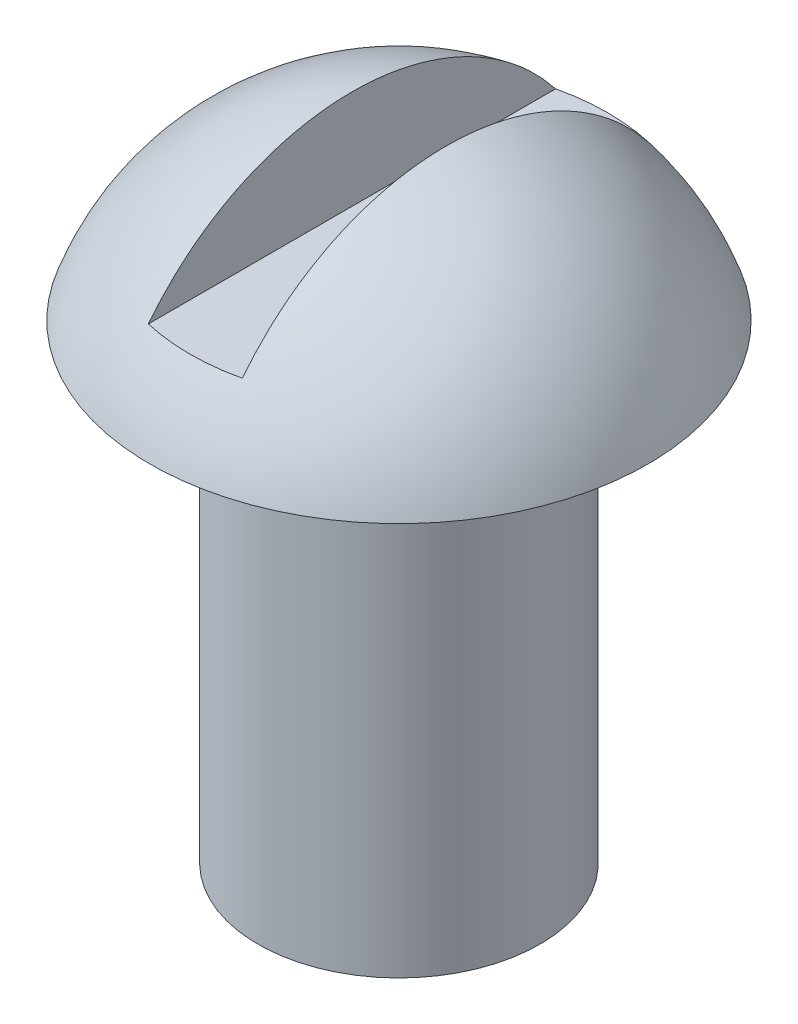
ISO-10303-21;
HEADER;
FILE_DESCRIPTION(('STEP AP214'),'2;1');
FILE_NAME('part.step','',(''),(''),'','','');
FILE_SCHEMA(('AUTOMOTIVE_DESIGN { 1 0 10303 214 1 1 1 1 }'));
ENDSEC;
DATA;
#1=APPLICATION_CONTEXT('core data for automotive mechanical design processes');
#2=APPLICATION_PROTOCOL_DEFINITION('international standard','automotive_design',2000,#1);
#3=PRODUCT_CONTEXT('',#1,'mechanical');
#4=PRODUCT('Part','Part','',(#3));
#5=PRODUCT_RELATED_PRODUCT_CATEGORY('part','',(#4));
#6=PRODUCT_DEFINITION_FORMATION('','',#4);
#7=PRODUCT_DEFINITION_CONTEXT('part definition',#1,'design');
#8=PRODUCT_DEFINITION('design','',#6,#7);
#9=PRODUCT_DEFINITION_SHAPE('','',#8);
#10=(LENGTH_UNIT() NAMED_UNIT(*) SI_UNIT(.MILLI.,.METRE.));
#11=(NAMED_UNIT(*) PLANE_ANGLE_UNIT() SI_UNIT($,.RADIAN.));
#12=(NAMED_UNIT(*) SI_UNIT($,.STERADIAN.) SOLID_ANGLE_UNIT());
#13=UNCERTAINTY_MEASURE_WITH_UNIT(LENGTH_MEASURE(1.E-05),#10,'distance_accuracy_value','');
#14=(GEOMETRIC_REPRESENTATION_CONTEXT(3) GLOBAL_UNCERTAINTY_ASSIGNED_CONTEXT((#13)) GLOBAL_UNIT_ASSIGNED_CONTEXT((#10,
#11,#12)) REPRESENTATION_CONTEXT('',''));
#15=CARTESIAN_POINT('',(0.,0.,0.));
#16=DIRECTION('',(0.,0.,1.));
#17=DIRECTION('',(1.,0.,0.));
#18=AXIS2_PLACEMENT_3D('',#15,#16,#17);
#19=CARTESIAN_POINT('',(0.,0.,0.));
#20=DIRECTION('',(0.,-1.,0.));
#21=DIRECTION('',(0.,0.,-1.));
#22=AXIS2_PLACEMENT_3D('',#19,#20,#21);
#23=PLANE('',#22);
#24=CARTESIAN_POINT('',(0.,0.,0.));
#25=DIRECTION('',(0.,-1.,0.));
#26=DIRECTION('',(0.,0.,-1.));
#27=AXIS2_PLACEMENT_3D('',#24,#25,#26);
#28=CIRCLE('',#27,2.65);
#29=CARTESIAN_POINT('',(0.,0.,-2.65));
#30=VERTEX_POINT('',#29);
#31=EDGE_CURVE('E65',#30,#30,#28,.T.);
#32=ORIENTED_EDGE('',*,*,#31,.T.);
#33=EDGE_LOOP('',(#32));
#34=FACE_BOUND('',#33,.T.);
#35=CARTESIAN_POINT('',(0.,0.,0.));
#36=DIRECTION('',(0.,-1.,0.));
#37=DIRECTION('',(0.,0.,-1.));
#38=AXIS2_PLACEMENT_3D('',#35,#36,#37);
#39=CIRCLE('',#38,1.5);
#40=CARTESIAN_POINT('',(0.,0.,-1.5));
#41=VERTEX_POINT('',#40);
#42=EDGE_CURVE('E75',#41,#41,#39,.T.);
#43=ORIENTED_EDGE('',*,*,#42,.F.);
#44=EDGE_LOOP('',(#43));
#45=FACE_BOUND('',#44,.T.);
#46=ADVANCED_FACE('F32',(#34,#45),#23,.T.);
#47=CARTESIAN_POINT('',(0.,-0.898026315789473,0.));
#48=DIRECTION('',(0.,-1.,0.));
#49=DIRECTION('',(1.,0.,0.));
#50=AXIS2_PLACEMENT_3D('',#47,#48,#49);
#51=SPHERICAL_SURFACE('',#50,2.79802631578947);
#52=ORIENTED_EDGE('',*,*,#31,.F.);
#53=EDGE_LOOP('',(#52));
#54=FACE_BOUND('',#53,.T.);
#55=CARTESIAN_POINT('',(-0.5,-0.898026315789473,0.));
#56=DIRECTION('',(-1.,0.,0.));
#57=DIRECTION('',(0.,0.,1.));
#58=AXIS2_PLACEMENT_3D('',#55,#56,#57);
#59=CIRCLE('',#58,2.75298951393761);
#60=CARTESIAN_POINT('',(-0.5,0.8,-2.16694667556376));
#61=VERTEX_POINT('',#60);
#62=CARTESIAN_POINT('',(-0.5,0.8,2.16694667556376));
#63=VERTEX_POINT('',#62);
#64=EDGE_CURVE('E64',#61,#63,#59,.F.);
#65=ORIENTED_EDGE('',*,*,#64,.F.);
#66=CARTESIAN_POINT('',(0.,0.8,0.));
#67=DIRECTION('',(0.,1.,0.));
#68=DIRECTION('',(0.,0.,1.));
#69=AXIS2_PLACEMENT_3D('',#66,#67,#68);
#70=CIRCLE('',#69,2.22388351644974);
#71=CARTESIAN_POINT('',(0.5,0.8,-2.16694667556376));
#72=VERTEX_POINT('',#71);
#73=EDGE_CURVE('E11',#61,#72,#70,.F.);
#74=ORIENTED_EDGE('',*,*,#73,.T.);
#75=CARTESIAN_POINT('',(0.5,-0.898026315789473,0.));
#76=DIRECTION('',(1.,0.,0.));
#77=DIRECTION('',(0.,0.,-1.));
#78=AXIS2_PLACEMENT_3D('',#75,#76,#77);
#79=CIRCLE('',#78,2.75298951393761);
#80=CARTESIAN_POINT('',(0.5,0.8,2.16694667556376));
#81=VERTEX_POINT('',#80);
#82=EDGE_CURVE('E36',#81,#72,#79,.F.);
#83=ORIENTED_EDGE('',*,*,#82,.F.);
#84=EDGE_CURVE('E42',#81,#63,#70,.F.);
#85=ORIENTED_EDGE('',*,*,#84,.T.);
#86=EDGE_LOOP('',(#65,#74,#83,#85));
#87=FACE_BOUND('',#86,.T.);
#88=ADVANCED_FACE('F34',(#54,#87),#51,.T.);
#89=CARTESIAN_POINT('',(0.5,0.8,-2.95379049089046));
#90=DIRECTION('',(1.,0.,0.));
#91=DIRECTION('',(0.,0.,-1.));
#92=AXIS2_PLACEMENT_3D('',#89,#90,#91);
#93=PLANE('',#92);
#94=ORIENTED_EDGE('',*,*,#82,.T.);
#95=DIRECTION('',(0.,0.,-1.));
#96=VECTOR('',#95,1.);
#97=CARTESIAN_POINT('',(0.5,0.8,-2.95379049089046));
#98=LINE('',#97,#96);
#99=EDGE_CURVE('E60',#81,#72,#98,.T.);
#100=ORIENTED_EDGE('',*,*,#99,.F.);
#101=EDGE_LOOP('',(#94,#100));
#102=FACE_BOUND('',#101,.T.);
#103=ADVANCED_FACE('F67',(#102),#93,.F.);
#104=CARTESIAN_POINT('',(-0.5,0.8,-2.95379049089046));
#105=DIRECTION('',(-1.,0.,0.));
#106=DIRECTION('',(0.,0.,1.));
#107=AXIS2_PLACEMENT_3D('',#104,#105,#106);
#108=PLANE('',#107);
#109=ORIENTED_EDGE('',*,*,#64,.T.);
#110=DIRECTION('',(0.,0.,1.));
#111=VECTOR('',#110,1.);
#112=CARTESIAN_POINT('',(-0.5,0.8,-2.95379049089046));
#113=LINE('',#112,#111);
#114=EDGE_CURVE('E49',#61,#63,#113,.T.);
#115=ORIENTED_EDGE('',*,*,#114,.F.);
#116=EDGE_LOOP('',(#109,#115));
#117=FACE_BOUND('',#116,.T.);
#118=ADVANCED_FACE('F98',(#117),#108,.F.);
#119=CARTESIAN_POINT('',(0.5,0.8,2.95379049089046));
#120=DIRECTION('',(0.,1.,0.));
#121=DIRECTION('',(0.,0.,1.));
#122=AXIS2_PLACEMENT_3D('',#119,#120,#121);
#123=PLANE('',#122);
#124=ORIENTED_EDGE('',*,*,#114,.T.);
#125=ORIENTED_EDGE('',*,*,#84,.F.);
#126=ORIENTED_EDGE('',*,*,#99,.T.);
#127=ORIENTED_EDGE('',*,*,#73,.F.);
#128=EDGE_LOOP('',(#124,#125,#126,#127));
#129=FACE_BOUND('',#128,.T.);
#130=ADVANCED_FACE('F59',(#129),#123,.T.);
#131=CARTESIAN_POINT('',(0.,-5.,0.));
#132=DIRECTION('',(0.,1.,0.));
#133=DIRECTION('',(0.,0.,1.));
#134=AXIS2_PLACEMENT_3D('',#131,#132,#133);
#135=CYLINDRICAL_SURFACE('',#134,1.5);
#136=CARTESIAN_POINT('',(0.,-5.,0.));
#137=DIRECTION('',(0.,-1.,0.));
#138=DIRECTION('',(0.,0.,-1.));
#139=AXIS2_PLACEMENT_3D('',#136,#137,#138);
#140=CIRCLE('',#139,1.5);
#141=CARTESIAN_POINT('',(0.,-5.,-1.5));
#142=VERTEX_POINT('',#141);
#143=EDGE_CURVE('E68',#142,#142,#140,.T.);
#144=ORIENTED_EDGE('',*,*,#143,.F.);
#145=EDGE_LOOP('',(#144));
#146=FACE_BOUND('',#145,.T.);
#147=ORIENTED_EDGE('',*,*,#42,.T.);
#148=EDGE_LOOP('',(#147));
#149=FACE_BOUND('',#148,.T.);
#150=ADVANCED_FACE('F83',(#146,#149),#135,.T.);
#151=CARTESIAN_POINT('',(0.,-5.,0.));
#152=DIRECTION('',(0.,-1.,0.));
#153=DIRECTION('',(0.,0.,-1.));
#154=AXIS2_PLACEMENT_3D('',#151,#152,#153);
#155=PLANE('',#154);
#156=ORIENTED_EDGE('',*,*,#143,.T.);
#157=EDGE_LOOP('',(#156));
#158=FACE_BOUND('',#157,.T.);
#159=ADVANCED_FACE('F81',(#158),#155,.T.);
#160=CLOSED_SHELL('',(#46,#88,#103,#118,#130,#150,#159));
#161=MANIFOLD_SOLID_BREP('B2',#160);
#162=ADVANCED_BREP_SHAPE_REPRESENTATION('',(#18,#161),#14);
#163=SHAPE_DEFINITION_REPRESENTATION(#9,#162);
ENDSEC;
END-ISO-10303-21;
